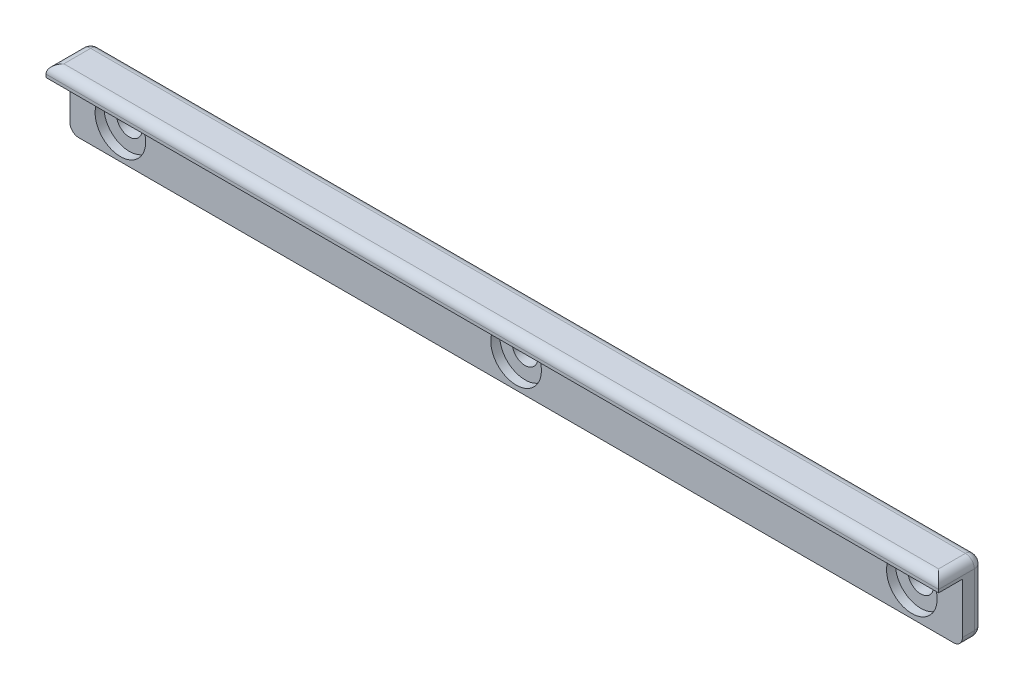
ISO-10303-21;
HEADER;
FILE_DESCRIPTION(('STEP AP214'),'2;1');
FILE_NAME('part.step','',(''),(''),'','','');
FILE_SCHEMA(('AUTOMOTIVE_DESIGN { 1 0 10303 214 1 1 1 1 }'));
ENDSEC;
DATA;
#1=APPLICATION_CONTEXT('core data for automotive mechanical design processes');
#2=APPLICATION_PROTOCOL_DEFINITION('international standard','automotive_design',2000,#1);
#3=PRODUCT_CONTEXT('',#1,'mechanical');
#4=PRODUCT('Part','Part','',(#3));
#5=PRODUCT_RELATED_PRODUCT_CATEGORY('part','',(#4));
#6=PRODUCT_DEFINITION_FORMATION('','',#4);
#7=PRODUCT_DEFINITION_CONTEXT('part definition',#1,'design');
#8=PRODUCT_DEFINITION('design','',#6,#7);
#9=PRODUCT_DEFINITION_SHAPE('','',#8);
#10=(LENGTH_UNIT() NAMED_UNIT(*) SI_UNIT(.MILLI.,.METRE.));
#11=(NAMED_UNIT(*) PLANE_ANGLE_UNIT() SI_UNIT($,.RADIAN.));
#12=(NAMED_UNIT(*) SI_UNIT($,.STERADIAN.) SOLID_ANGLE_UNIT());
#13=UNCERTAINTY_MEASURE_WITH_UNIT(LENGTH_MEASURE(1.E-05),#10,'distance_accuracy_value','');
#14=(GEOMETRIC_REPRESENTATION_CONTEXT(3) GLOBAL_UNCERTAINTY_ASSIGNED_CONTEXT((#13)) GLOBAL_UNIT_ASSIGNED_CONTEXT((#10,
#11,#12)) REPRESENTATION_CONTEXT('',''));
#15=CARTESIAN_POINT('',(0.,0.,0.));
#16=DIRECTION('',(0.,0.,1.));
#17=DIRECTION('',(1.,0.,0.));
#18=AXIS2_PLACEMENT_3D('',#15,#16,#17);
#19=CARTESIAN_POINT('',(0.,0.,1.5));
#20=DIRECTION('',(0.,0.,-1.));
#21=DIRECTION('',(-1.,0.,0.));
#22=AXIS2_PLACEMENT_3D('',#19,#20,#21);
#23=PLANE('',#22);
#24=DIRECTION('',(0.,-1.,0.));
#25=VECTOR('',#24,1.);
#26=CARTESIAN_POINT('',(0.,-10.,1.5));
#27=LINE('',#26,#25);
#28=CARTESIAN_POINT('',(0.,0.,1.5));
#29=VERTEX_POINT('',#28);
#30=CARTESIAN_POINT('',(0.,-8.50000000000002,1.5));
#31=VERTEX_POINT('',#30);
#32=EDGE_CURVE('E215',#29,#31,#27,.T.);
#33=ORIENTED_EDGE('',*,*,#32,.T.);
#34=CARTESIAN_POINT('',(1.5,-8.50000000000002,1.5));
#35=DIRECTION('',(0.,0.,-1.));
#36=DIRECTION('',(-1.,0.,0.));
#37=AXIS2_PLACEMENT_3D('',#34,#35,#36);
#38=CIRCLE('',#37,1.5);
#39=CARTESIAN_POINT('',(1.5,-10.,1.5));
#40=VERTEX_POINT('',#39);
#41=EDGE_CURVE('E266',#31,#40,#38,.F.);
#42=ORIENTED_EDGE('',*,*,#41,.T.);
#43=DIRECTION('',(1.,0.,0.));
#44=VECTOR('',#43,1.);
#45=CARTESIAN_POINT('',(150.,-10.,1.5));
#46=LINE('',#45,#44);
#47=CARTESIAN_POINT('',(148.5,-10.,1.5));
#48=VERTEX_POINT('',#47);
#49=EDGE_CURVE('E222',#40,#48,#46,.T.);
#50=ORIENTED_EDGE('',*,*,#49,.T.);
#51=CARTESIAN_POINT('',(148.5,-8.5,1.5));
#52=DIRECTION('',(0.,0.,-1.));
#53=DIRECTION('',(-1.,0.,0.));
#54=AXIS2_PLACEMENT_3D('',#51,#52,#53);
#55=CIRCLE('',#54,1.5);
#56=CARTESIAN_POINT('',(150.,-8.5,1.5));
#57=VERTEX_POINT('',#56);
#58=EDGE_CURVE('E263',#48,#57,#55,.F.);
#59=ORIENTED_EDGE('',*,*,#58,.T.);
#60=DIRECTION('',(0.,1.,0.));
#61=VECTOR('',#60,1.);
#62=CARTESIAN_POINT('',(150.,0.,1.5));
#63=LINE('',#62,#61);
#64=CARTESIAN_POINT('',(150.,0.,1.5));
#65=VERTEX_POINT('',#64);
#66=EDGE_CURVE('E226',#57,#65,#63,.T.);
#67=ORIENTED_EDGE('',*,*,#66,.T.);
#68=DIRECTION('',(-1.,0.,0.));
#69=VECTOR('',#68,1.);
#70=CARTESIAN_POINT('',(0.,0.,1.5));
#71=LINE('',#70,#69);
#72=EDGE_CURVE('E141',#65,#29,#71,.T.);
#73=ORIENTED_EDGE('',*,*,#72,.T.);
#74=EDGE_LOOP('',(#33,#42,#50,#59,#67,#73));
#75=FACE_BOUND('',#74,.T.);
#76=CARTESIAN_POINT('',(75.,-5.00000000000001,1.5));
#77=DIRECTION('',(0.,0.,1.));
#78=DIRECTION('',(1.,0.,0.));
#79=AXIS2_PLACEMENT_3D('',#76,#77,#78);
#80=CIRCLE('',#79,4.25000000000001);
#81=CARTESIAN_POINT('',(79.25,-5.00000000000001,1.5));
#82=VERTEX_POINT('',#81);
#83=EDGE_CURVE('E211',#82,#82,#80,.T.);
#84=ORIENTED_EDGE('',*,*,#83,.F.);
#85=EDGE_LOOP('',(#84));
#86=FACE_BOUND('',#85,.T.);
#87=CARTESIAN_POINT('',(141.5,-5.,1.5));
#88=DIRECTION('',(0.,0.,1.));
#89=DIRECTION('',(1.,0.,0.));
#90=AXIS2_PLACEMENT_3D('',#87,#88,#89);
#91=CIRCLE('',#90,4.25000000000001);
#92=CARTESIAN_POINT('',(145.75,-5.,1.5));
#93=VERTEX_POINT('',#92);
#94=EDGE_CURVE('E203',#93,#93,#91,.T.);
#95=ORIENTED_EDGE('',*,*,#94,.F.);
#96=EDGE_LOOP('',(#95));
#97=FACE_BOUND('',#96,.T.);
#98=CARTESIAN_POINT('',(8.49999999999999,-5.,1.5));
#99=DIRECTION('',(0.,0.,1.));
#100=DIRECTION('',(1.,0.,0.));
#101=AXIS2_PLACEMENT_3D('',#98,#99,#100);
#102=CIRCLE('',#101,4.25);
#103=CARTESIAN_POINT('',(12.75,-5.,1.5));
#104=VERTEX_POINT('',#103);
#105=EDGE_CURVE('E195',#104,#104,#102,.T.);
#106=ORIENTED_EDGE('',*,*,#105,.F.);
#107=EDGE_LOOP('',(#106));
#108=FACE_BOUND('',#107,.T.);
#109=ADVANCED_FACE('F45',(#75,#86,#97,#108),#23,.F.);
#110=CARTESIAN_POINT('',(0.,-10.,1.5));
#111=DIRECTION('',(1.,0.,0.));
#112=DIRECTION('',(0.,0.,-1.));
#113=AXIS2_PLACEMENT_3D('',#110,#111,#112);
#114=PLANE('',#113);
#115=DIRECTION('',(0.,1.,0.));
#116=VECTOR('',#115,1.);
#117=CARTESIAN_POINT('',(0.,-10.,-0.5));
#118=LINE('',#117,#116);
#119=CARTESIAN_POINT('',(0.,0.5,-0.5));
#120=VERTEX_POINT('',#119);
#121=CARTESIAN_POINT('',(0.,-8.50000000000002,-0.5));
#122=VERTEX_POINT('',#121);
#123=EDGE_CURVE('E247',#120,#122,#118,.F.);
#124=ORIENTED_EDGE('',*,*,#123,.T.);
#125=DIRECTION('',(0.,0.,-1.));
#126=VECTOR('',#125,1.);
#127=CARTESIAN_POINT('',(0.,-8.50000000000002,1.5));
#128=LINE('',#127,#126);
#129=EDGE_CURVE('E251',#122,#31,#128,.F.);
#130=ORIENTED_EDGE('',*,*,#129,.T.);
#131=ORIENTED_EDGE('',*,*,#32,.F.);
#132=DIRECTION('',(0.,0.,1.));
#133=VECTOR('',#132,1.);
#134=CARTESIAN_POINT('',(0.,0.,-2.));
#135=LINE('',#134,#133);
#136=CARTESIAN_POINT('',(0.,0.,5.5));
#137=VERTEX_POINT('',#136);
#138=EDGE_CURVE('E145',#29,#137,#135,.T.);
#139=ORIENTED_EDGE('',*,*,#138,.T.);
#140=DIRECTION('',(0.,-1.,0.));
#141=VECTOR('',#140,1.);
#142=CARTESIAN_POINT('',(0.,0.,5.5));
#143=LINE('',#142,#141);
#144=CARTESIAN_POINT('',(0.,0.5,5.5));
#145=VERTEX_POINT('',#144);
#146=EDGE_CURVE('E146',#145,#137,#143,.T.);
#147=ORIENTED_EDGE('',*,*,#146,.F.);
#148=DIRECTION('',(0.,0.,1.));
#149=VECTOR('',#148,1.);
#150=CARTESIAN_POINT('',(0.,0.5,-2.));
#151=LINE('',#150,#149);
#152=EDGE_CURVE('E244',#145,#120,#151,.F.);
#153=ORIENTED_EDGE('',*,*,#152,.T.);
#154=EDGE_LOOP('',(#124,#130,#131,#139,#147,#153));
#155=FACE_BOUND('',#154,.T.);
#156=ADVANCED_FACE('F391',(#155),#114,.F.);
#157=CARTESIAN_POINT('',(150.,-10.,1.5));
#158=DIRECTION('',(0.,1.,0.));
#159=DIRECTION('',(-1.,0.,0.));
#160=AXIS2_PLACEMENT_3D('',#157,#158,#159);
#161=PLANE('',#160);
#162=ORIENTED_EDGE('',*,*,#49,.F.);
#163=DIRECTION('',(0.,0.,-1.));
#164=VECTOR('',#163,1.);
#165=CARTESIAN_POINT('',(1.5,-10.,1.5));
#166=LINE('',#165,#164);
#167=CARTESIAN_POINT('',(1.5,-10.,-0.5));
#168=VERTEX_POINT('',#167);
#169=EDGE_CURVE('E260',#40,#168,#166,.T.);
#170=ORIENTED_EDGE('',*,*,#169,.T.);
#171=DIRECTION('',(-1.,0.,0.));
#172=VECTOR('',#171,1.);
#173=CARTESIAN_POINT('',(150.,-10.,-0.5));
#174=LINE('',#173,#172);
#175=CARTESIAN_POINT('',(148.5,-10.,-0.5));
#176=VERTEX_POINT('',#175);
#177=EDGE_CURVE('E257',#168,#176,#174,.F.);
#178=ORIENTED_EDGE('',*,*,#177,.T.);
#179=DIRECTION('',(0.,0.,-1.));
#180=VECTOR('',#179,1.);
#181=CARTESIAN_POINT('',(148.5,-10.,1.5));
#182=LINE('',#181,#180);
#183=EDGE_CURVE('E254',#176,#48,#182,.F.);
#184=ORIENTED_EDGE('',*,*,#183,.T.);
#185=EDGE_LOOP('',(#162,#170,#178,#184));
#186=FACE_BOUND('',#185,.T.);
#187=ADVANCED_FACE('F351',(#186),#161,.F.);
#188=CARTESIAN_POINT('',(150.,0.,1.5));
#189=DIRECTION('',(-1.,0.,0.));
#190=DIRECTION('',(0.,0.,1.));
#191=AXIS2_PLACEMENT_3D('',#188,#189,#190);
#192=PLANE('',#191);
#193=ORIENTED_EDGE('',*,*,#66,.F.);
#194=DIRECTION('',(0.,0.,-1.));
#195=VECTOR('',#194,1.);
#196=CARTESIAN_POINT('',(150.,-8.5,1.5));
#197=LINE('',#196,#195);
#198=CARTESIAN_POINT('',(150.,-8.5,-0.5));
#199=VERTEX_POINT('',#198);
#200=EDGE_CURVE('E274',#57,#199,#197,.T.);
#201=ORIENTED_EDGE('',*,*,#200,.T.);
#202=DIRECTION('',(0.,-1.,0.));
#203=VECTOR('',#202,1.);
#204=CARTESIAN_POINT('',(150.,0.,-0.5));
#205=LINE('',#204,#203);
#206=CARTESIAN_POINT('',(150.,0.5,-0.5));
#207=VERTEX_POINT('',#206);
#208=EDGE_CURVE('E271',#199,#207,#205,.F.);
#209=ORIENTED_EDGE('',*,*,#208,.T.);
#210=DIRECTION('',(0.,0.,1.));
#211=VECTOR('',#210,1.);
#212=CARTESIAN_POINT('',(150.,0.5,5.5));
#213=LINE('',#212,#211);
#214=CARTESIAN_POINT('',(150.,0.5,5.5));
#215=VERTEX_POINT('',#214);
#216=EDGE_CURVE('E152',#207,#215,#213,.T.);
#217=ORIENTED_EDGE('',*,*,#216,.T.);
#218=DIRECTION('',(0.,1.,0.));
#219=VECTOR('',#218,1.);
#220=CARTESIAN_POINT('',(150.,2.,5.5));
#221=LINE('',#220,#219);
#222=CARTESIAN_POINT('',(150.,0.,5.5));
#223=VERTEX_POINT('',#222);
#224=EDGE_CURVE('E149',#223,#215,#221,.T.);
#225=ORIENTED_EDGE('',*,*,#224,.F.);
#226=DIRECTION('',(0.,0.,1.));
#227=VECTOR('',#226,1.);
#228=CARTESIAN_POINT('',(150.,0.,-2.));
#229=LINE('',#228,#227);
#230=EDGE_CURVE('E135',#65,#223,#229,.T.);
#231=ORIENTED_EDGE('',*,*,#230,.F.);
#232=EDGE_LOOP('',(#193,#201,#209,#217,#225,#231));
#233=FACE_BOUND('',#232,.T.);
#234=ADVANCED_FACE('F150',(#233),#192,.F.);
#235=CARTESIAN_POINT('',(75.,-5.00000000000001,1.5));
#236=DIRECTION('',(0.,0.,-1.));
#237=DIRECTION('',(-1.,0.,0.));
#238=AXIS2_PLACEMENT_3D('',#235,#236,#237);
#239=CYLINDRICAL_SURFACE('',#238,4.25000000000001);
#240=ORIENTED_EDGE('',*,*,#83,.T.);
#241=EDGE_LOOP('',(#240));
#242=FACE_BOUND('',#241,.T.);
#243=CARTESIAN_POINT('',(75.,-5.00000000000001,0.));
#244=DIRECTION('',(0.,0.,1.));
#245=DIRECTION('',(1.,0.,0.));
#246=AXIS2_PLACEMENT_3D('',#243,#244,#245);
#247=CIRCLE('',#246,4.25000000000001);
#248=CARTESIAN_POINT('',(79.25,-5.00000000000001,0.));
#249=VERTEX_POINT('',#248);
#250=EDGE_CURVE('E207',#249,#249,#247,.T.);
#251=ORIENTED_EDGE('',*,*,#250,.F.);
#252=EDGE_LOOP('',(#251));
#253=FACE_BOUND('',#252,.T.);
#254=ADVANCED_FACE('F416',(#242,#253),#239,.F.);
#255=CARTESIAN_POINT('',(141.5,-5.,1.5));
#256=DIRECTION('',(0.,0.,-1.));
#257=DIRECTION('',(-1.,0.,0.));
#258=AXIS2_PLACEMENT_3D('',#255,#256,#257);
#259=CYLINDRICAL_SURFACE('',#258,4.25000000000001);
#260=ORIENTED_EDGE('',*,*,#94,.T.);
#261=EDGE_LOOP('',(#260));
#262=FACE_BOUND('',#261,.T.);
#263=CARTESIAN_POINT('',(141.5,-5.,0.));
#264=DIRECTION('',(0.,0.,1.));
#265=DIRECTION('',(1.,0.,0.));
#266=AXIS2_PLACEMENT_3D('',#263,#264,#265);
#267=CIRCLE('',#266,4.25000000000001);
#268=CARTESIAN_POINT('',(145.75,-5.,0.));
#269=VERTEX_POINT('',#268);
#270=EDGE_CURVE('E199',#269,#269,#267,.T.);
#271=ORIENTED_EDGE('',*,*,#270,.F.);
#272=EDGE_LOOP('',(#271));
#273=FACE_BOUND('',#272,.T.);
#274=ADVANCED_FACE('F619',(#262,#273),#259,.F.);
#275=CARTESIAN_POINT('',(8.49999999999999,-5.,1.5));
#276=DIRECTION('',(0.,0.,-1.));
#277=DIRECTION('',(-1.,0.,0.));
#278=AXIS2_PLACEMENT_3D('',#275,#276,#277);
#279=CYLINDRICAL_SURFACE('',#278,4.25);
#280=ORIENTED_EDGE('',*,*,#105,.T.);
#281=EDGE_LOOP('',(#280));
#282=FACE_BOUND('',#281,.T.);
#283=CARTESIAN_POINT('',(8.49999999999999,-5.,0.));
#284=DIRECTION('',(0.,0.,1.));
#285=DIRECTION('',(1.,0.,0.));
#286=AXIS2_PLACEMENT_3D('',#283,#284,#285);
#287=CIRCLE('',#286,4.25);
#288=CARTESIAN_POINT('',(12.75,-5.,0.));
#289=VERTEX_POINT('',#288);
#290=EDGE_CURVE('E191',#289,#289,#287,.T.);
#291=ORIENTED_EDGE('',*,*,#290,.F.);
#292=EDGE_LOOP('',(#291));
#293=FACE_BOUND('',#292,.T.);
#294=ADVANCED_FACE('F611',(#282,#293),#279,.F.);
#295=CARTESIAN_POINT('',(0.,0.,0.));
#296=DIRECTION('',(0.,0.,1.));
#297=DIRECTION('',(1.,0.,0.));
#298=AXIS2_PLACEMENT_3D('',#295,#296,#297);
#299=PLANE('',#298);
#300=CARTESIAN_POINT('',(141.5,-5.,0.));
#301=DIRECTION('',(0.,0.,-1.));
#302=DIRECTION('',(-1.,0.,0.));
#303=AXIS2_PLACEMENT_3D('',#300,#301,#302);
#304=CIRCLE('',#303,2.15000000000002);
#305=CARTESIAN_POINT('',(139.35,-5.,0.));
#306=VERTEX_POINT('',#305);
#307=EDGE_CURVE('E169',#306,#306,#304,.T.);
#308=ORIENTED_EDGE('',*,*,#307,.T.);
#309=EDGE_LOOP('',(#308));
#310=FACE_BOUND('',#309,.T.);
#311=ORIENTED_EDGE('',*,*,#270,.T.);
#312=EDGE_LOOP('',(#311));
#313=FACE_BOUND('',#312,.T.);
#314=ADVANCED_FACE('F597',(#310,#313),#299,.T.);
#315=CARTESIAN_POINT('',(75.,-5.00000000000001,0.));
#316=DIRECTION('',(0.,0.,-1.));
#317=DIRECTION('',(-1.,0.,0.));
#318=AXIS2_PLACEMENT_3D('',#315,#316,#317);
#319=CIRCLE('',#318,2.15);
#320=CARTESIAN_POINT('',(72.85,-5.00000000000001,0.));
#321=VERTEX_POINT('',#320);
#322=EDGE_CURVE('E175',#321,#321,#319,.T.);
#323=ORIENTED_EDGE('',*,*,#322,.T.);
#324=EDGE_LOOP('',(#323));
#325=FACE_BOUND('',#324,.T.);
#326=ORIENTED_EDGE('',*,*,#250,.T.);
#327=EDGE_LOOP('',(#326));
#328=FACE_BOUND('',#327,.T.);
#329=ADVANCED_FACE('F594',(#325,#328),#299,.T.);
#330=CARTESIAN_POINT('',(8.49999999999999,-5.,0.));
#331=DIRECTION('',(0.,0.,-1.));
#332=DIRECTION('',(-1.,0.,0.));
#333=AXIS2_PLACEMENT_3D('',#330,#331,#332);
#334=CIRCLE('',#333,2.15);
#335=CARTESIAN_POINT('',(6.34999999999999,-5.,0.));
#336=VERTEX_POINT('',#335);
#337=EDGE_CURVE('E183',#336,#336,#334,.T.);
#338=ORIENTED_EDGE('',*,*,#337,.T.);
#339=EDGE_LOOP('',(#338));
#340=FACE_BOUND('',#339,.T.);
#341=ORIENTED_EDGE('',*,*,#290,.T.);
#342=EDGE_LOOP('',(#341));
#343=FACE_BOUND('',#342,.T.);
#344=ADVANCED_FACE('F439',(#340,#343),#299,.T.);
#345=CARTESIAN_POINT('',(0.,0.,-2.));
#346=DIRECTION('',(0.,0.,1.));
#347=DIRECTION('',(1.,0.,0.));
#348=AXIS2_PLACEMENT_3D('',#345,#346,#347);
#349=PLANE('',#348);
#350=DIRECTION('',(-1.,0.,0.));
#351=VECTOR('',#350,1.);
#352=CARTESIAN_POINT('',(0.,-8.50000000000002,-2.));
#353=LINE('',#352,#351);
#354=CARTESIAN_POINT('',(148.5,-8.5,-2.));
#355=VERTEX_POINT('',#354);
#356=CARTESIAN_POINT('',(1.5,-8.50000000000002,-2.));
#357=VERTEX_POINT('',#356);
#358=EDGE_CURVE('E237',#355,#357,#353,.T.);
#359=ORIENTED_EDGE('',*,*,#358,.T.);
#360=DIRECTION('',(0.,1.,0.));
#361=VECTOR('',#360,1.);
#362=CARTESIAN_POINT('',(1.5,0.,-2.));
#363=LINE('',#362,#361);
#364=CARTESIAN_POINT('',(1.5,0.5,-2.));
#365=VERTEX_POINT('',#364);
#366=EDGE_CURVE('E240',#357,#365,#363,.T.);
#367=ORIENTED_EDGE('',*,*,#366,.T.);
#368=DIRECTION('',(-1.,0.,0.));
#369=VECTOR('',#368,1.);
#370=CARTESIAN_POINT('',(150.,0.5,-2.));
#371=LINE('',#370,#369);
#372=CARTESIAN_POINT('',(148.5,0.5,-2.));
#373=VERTEX_POINT('',#372);
#374=EDGE_CURVE('E231',#365,#373,#371,.F.);
#375=ORIENTED_EDGE('',*,*,#374,.T.);
#376=DIRECTION('',(0.,-1.,0.));
#377=VECTOR('',#376,1.);
#378=CARTESIAN_POINT('',(148.5,0.,-2.));
#379=LINE('',#378,#377);
#380=EDGE_CURVE('E234',#373,#355,#379,.T.);
#381=ORIENTED_EDGE('',*,*,#380,.T.);
#382=EDGE_LOOP('',(#359,#367,#375,#381));
#383=FACE_BOUND('',#382,.T.);
#384=CARTESIAN_POINT('',(8.49999999999999,-5.,-2.));
#385=DIRECTION('',(0.,0.,-1.));
#386=DIRECTION('',(-1.,0.,0.));
#387=AXIS2_PLACEMENT_3D('',#384,#385,#386);
#388=CIRCLE('',#387,2.15);
#389=CARTESIAN_POINT('',(6.34999999999999,-5.,-2.));
#390=VERTEX_POINT('',#389);
#391=EDGE_CURVE('E187',#390,#390,#388,.T.);
#392=ORIENTED_EDGE('',*,*,#391,.F.);
#393=EDGE_LOOP('',(#392));
#394=FACE_BOUND('',#393,.T.);
#395=CARTESIAN_POINT('',(75.,-5.00000000000001,-2.));
#396=DIRECTION('',(0.,0.,-1.));
#397=DIRECTION('',(-1.,0.,0.));
#398=AXIS2_PLACEMENT_3D('',#395,#396,#397);
#399=CIRCLE('',#398,2.15);
#400=CARTESIAN_POINT('',(72.85,-5.00000000000001,-2.));
#401=VERTEX_POINT('',#400);
#402=EDGE_CURVE('E179',#401,#401,#399,.T.);
#403=ORIENTED_EDGE('',*,*,#402,.F.);
#404=EDGE_LOOP('',(#403));
#405=FACE_BOUND('',#404,.T.);
#406=CARTESIAN_POINT('',(141.5,-5.,-2.));
#407=DIRECTION('',(0.,0.,-1.));
#408=DIRECTION('',(-1.,0.,0.));
#409=AXIS2_PLACEMENT_3D('',#406,#407,#408);
#410=CIRCLE('',#409,2.15000000000002);
#411=CARTESIAN_POINT('',(139.35,-5.,-2.));
#412=VERTEX_POINT('',#411);
#413=EDGE_CURVE('E171',#412,#412,#410,.T.);
#414=ORIENTED_EDGE('',*,*,#413,.F.);
#415=EDGE_LOOP('',(#414));
#416=FACE_BOUND('',#415,.T.);
#417=ADVANCED_FACE('F367',(#383,#394,#405,#416),#349,.F.);
#418=CARTESIAN_POINT('',(8.49999999999999,-5.,-2.));
#419=DIRECTION('',(0.,0.,1.));
#420=DIRECTION('',(1.,0.,0.));
#421=AXIS2_PLACEMENT_3D('',#418,#419,#420);
#422=CYLINDRICAL_SURFACE('',#421,2.15);
#423=ORIENTED_EDGE('',*,*,#391,.T.);
#424=EDGE_LOOP('',(#423));
#425=FACE_BOUND('',#424,.T.);
#426=ORIENTED_EDGE('',*,*,#337,.F.);
#427=EDGE_LOOP('',(#426));
#428=FACE_BOUND('',#427,.T.);
#429=ADVANCED_FACE('F438',(#425,#428),#422,.F.);
#430=CARTESIAN_POINT('',(75.,-5.00000000000001,-2.));
#431=DIRECTION('',(0.,0.,1.));
#432=DIRECTION('',(1.,0.,0.));
#433=AXIS2_PLACEMENT_3D('',#430,#431,#432);
#434=CYLINDRICAL_SURFACE('',#433,2.15);
#435=ORIENTED_EDGE('',*,*,#402,.T.);
#436=EDGE_LOOP('',(#435));
#437=FACE_BOUND('',#436,.T.);
#438=ORIENTED_EDGE('',*,*,#322,.F.);
#439=EDGE_LOOP('',(#438));
#440=FACE_BOUND('',#439,.T.);
#441=ADVANCED_FACE('F565',(#437,#440),#434,.F.);
#442=CARTESIAN_POINT('',(141.5,-5.,-2.));
#443=DIRECTION('',(0.,0.,1.));
#444=DIRECTION('',(1.,0.,0.));
#445=AXIS2_PLACEMENT_3D('',#442,#443,#444);
#446=CYLINDRICAL_SURFACE('',#445,2.15000000000002);
#447=ORIENTED_EDGE('',*,*,#413,.T.);
#448=EDGE_LOOP('',(#447));
#449=FACE_BOUND('',#448,.T.);
#450=ORIENTED_EDGE('',*,*,#307,.F.);
#451=EDGE_LOOP('',(#450));
#452=FACE_BOUND('',#451,.T.);
#453=ADVANCED_FACE('F557',(#449,#452),#446,.F.);
#454=CARTESIAN_POINT('',(150.,0.,-2.));
#455=DIRECTION('',(0.,-1.,0.));
#456=DIRECTION('',(0.,0.,-1.));
#457=AXIS2_PLACEMENT_3D('',#454,#455,#456);
#458=PLANE('',#457);
#459=ORIENTED_EDGE('',*,*,#72,.F.);
#460=ORIENTED_EDGE('',*,*,#230,.T.);
#461=DIRECTION('',(1.,0.,0.));
#462=VECTOR('',#461,1.);
#463=CARTESIAN_POINT('',(150.,0.,5.5));
#464=LINE('',#463,#462);
#465=EDGE_CURVE('E139',#137,#223,#464,.T.);
#466=ORIENTED_EDGE('',*,*,#465,.F.);
#467=ORIENTED_EDGE('',*,*,#138,.F.);
#468=EDGE_LOOP('',(#459,#460,#466,#467));
#469=FACE_BOUND('',#468,.T.);
#470=ADVANCED_FACE('F137',(#469),#458,.T.);
#471=CARTESIAN_POINT('',(0.,2.,-2.));
#472=DIRECTION('',(0.,1.,0.));
#473=DIRECTION('',(0.,0.,1.));
#474=AXIS2_PLACEMENT_3D('',#471,#472,#473);
#475=PLANE('',#474);
#476=DIRECTION('',(0.,0.,1.));
#477=VECTOR('',#476,1.);
#478=CARTESIAN_POINT('',(1.5,2.,5.5));
#479=LINE('',#478,#477);
#480=CARTESIAN_POINT('',(1.5,2.,-0.5));
#481=VERTEX_POINT('',#480);
#482=CARTESIAN_POINT('',(1.5,2.,4.));
#483=VERTEX_POINT('',#482);
#484=EDGE_CURVE('E67',#481,#483,#479,.T.);
#485=ORIENTED_EDGE('',*,*,#484,.T.);
#486=DIRECTION('',(-1.,0.,0.));
#487=VECTOR('',#486,1.);
#488=CARTESIAN_POINT('',(150.,2.,4.));
#489=LINE('',#488,#487);
#490=CARTESIAN_POINT('',(148.5,2.,4.));
#491=VERTEX_POINT('',#490);
#492=EDGE_CURVE('E55',#483,#491,#489,.F.);
#493=ORIENTED_EDGE('',*,*,#492,.T.);
#494=DIRECTION('',(0.,0.,1.));
#495=VECTOR('',#494,1.);
#496=CARTESIAN_POINT('',(148.5,2.,-2.));
#497=LINE('',#496,#495);
#498=CARTESIAN_POINT('',(148.5,2.,-0.5));
#499=VERTEX_POINT('',#498);
#500=EDGE_CURVE('E282',#491,#499,#497,.F.);
#501=ORIENTED_EDGE('',*,*,#500,.T.);
#502=DIRECTION('',(-1.,0.,0.));
#503=VECTOR('',#502,1.);
#504=CARTESIAN_POINT('',(0.,2.,-0.5));
#505=LINE('',#504,#503);
#506=EDGE_CURVE('E277',#499,#481,#505,.T.);
#507=ORIENTED_EDGE('',*,*,#506,.T.);
#508=EDGE_LOOP('',(#485,#493,#501,#507));
#509=FACE_BOUND('',#508,.T.);
#510=ADVANCED_FACE('F380',(#509),#475,.T.);
#511=CARTESIAN_POINT('',(0.,0.,5.5));
#512=DIRECTION('',(0.,0.,-1.));
#513=DIRECTION('',(-1.,0.,0.));
#514=AXIS2_PLACEMENT_3D('',#511,#512,#513);
#515=PLANE('',#514);
#516=ORIENTED_EDGE('',*,*,#224,.T.);
#517=DIRECTION('',(-1.,0.,0.));
#518=VECTOR('',#517,1.);
#519=CARTESIAN_POINT('',(0.,0.5,5.5));
#520=LINE('',#519,#518);
#521=EDGE_CURVE('E11',#215,#145,#520,.T.);
#522=ORIENTED_EDGE('',*,*,#521,.T.);
#523=ORIENTED_EDGE('',*,*,#146,.T.);
#524=ORIENTED_EDGE('',*,*,#465,.T.);
#525=EDGE_LOOP('',(#516,#522,#523,#524));
#526=FACE_BOUND('',#525,.T.);
#527=ADVANCED_FACE('F157',(#526),#515,.F.);
#528=CARTESIAN_POINT('',(148.5,-8.5,1.5));
#529=DIRECTION('',(0.,0.,-1.));
#530=DIRECTION('',(-1.,0.,0.));
#531=AXIS2_PLACEMENT_3D('',#528,#529,#530);
#532=CYLINDRICAL_SURFACE('',#531,1.5);
#533=ORIENTED_EDGE('',*,*,#58,.F.);
#534=ORIENTED_EDGE('',*,*,#183,.F.);
#535=CARTESIAN_POINT('',(148.5,-8.5,-0.5));
#536=DIRECTION('',(0.,0.,-1.));
#537=DIRECTION('',(-1.,0.,0.));
#538=AXIS2_PLACEMENT_3D('',#535,#536,#537);
#539=CIRCLE('',#538,1.5);
#540=EDGE_CURVE('E49',#199,#176,#539,.T.);
#541=ORIENTED_EDGE('',*,*,#540,.F.);
#542=ORIENTED_EDGE('',*,*,#200,.F.);
#543=EDGE_LOOP('',(#533,#534,#541,#542));
#544=FACE_BOUND('',#543,.T.);
#545=ADVANCED_FACE('F47',(#544),#532,.T.);
#546=CARTESIAN_POINT('',(148.5,0.,-0.5));
#547=DIRECTION('',(0.,-1.,0.));
#548=DIRECTION('',(0.,0.,-1.));
#549=AXIS2_PLACEMENT_3D('',#546,#547,#548);
#550=CYLINDRICAL_SURFACE('',#549,1.5);
#551=CARTESIAN_POINT('',(148.5,0.5,-0.5));
#552=DIRECTION('',(0.,1.,0.));
#553=DIRECTION('',(0.,0.,1.));
#554=AXIS2_PLACEMENT_3D('',#551,#552,#553);
#555=CIRCLE('',#554,1.5);
#556=EDGE_CURVE('E329',#207,#373,#555,.T.);
#557=ORIENTED_EDGE('',*,*,#556,.F.);
#558=ORIENTED_EDGE('',*,*,#208,.F.);
#559=CARTESIAN_POINT('',(148.5,-8.5,-0.5));
#560=DIRECTION('',(0.,-1.,0.));
#561=DIRECTION('',(0.,0.,-1.));
#562=AXIS2_PLACEMENT_3D('',#559,#560,#561);
#563=CIRCLE('',#562,1.5);
#564=EDGE_CURVE('E164',#355,#199,#563,.T.);
#565=ORIENTED_EDGE('',*,*,#564,.F.);
#566=ORIENTED_EDGE('',*,*,#380,.F.);
#567=EDGE_LOOP('',(#557,#558,#565,#566));
#568=FACE_BOUND('',#567,.T.);
#569=ADVANCED_FACE('F344',(#568),#550,.T.);
#570=CARTESIAN_POINT('',(148.5,0.5,1.5));
#571=DIRECTION('',(0.,0.,-1.));
#572=DIRECTION('',(-1.,0.,0.));
#573=AXIS2_PLACEMENT_3D('',#570,#571,#572);
#574=CYLINDRICAL_SURFACE('',#573,1.5);
#575=CARTESIAN_POINT('',(148.5,0.5,4.));
#576=DIRECTION('',(0.707106781186547,0.,-0.707106781186547));
#577=DIRECTION('',(0.707106781186547,0.,0.707106781186547));
#578=AXIS2_PLACEMENT_3D('',#575,#576,#577);
#579=ELLIPSE('',#578,2.12132034355964,1.5);
#580=EDGE_CURVE('E321',#215,#491,#579,.F.);
#581=ORIENTED_EDGE('',*,*,#580,.F.);
#582=ORIENTED_EDGE('',*,*,#216,.F.);
#583=CARTESIAN_POINT('',(148.5,0.5,-0.5));
#584=DIRECTION('',(0.,0.,-1.));
#585=DIRECTION('',(-1.,0.,0.));
#586=AXIS2_PLACEMENT_3D('',#583,#584,#585);
#587=CIRCLE('',#586,1.5);
#588=EDGE_CURVE('E325',#499,#207,#587,.T.);
#589=ORIENTED_EDGE('',*,*,#588,.F.);
#590=ORIENTED_EDGE('',*,*,#500,.F.);
#591=EDGE_LOOP('',(#581,#582,#589,#590));
#592=FACE_BOUND('',#591,.T.);
#593=ADVANCED_FACE('F379',(#592),#574,.T.);
#594=CARTESIAN_POINT('',(148.5,-8.5,-0.5));
#595=DIRECTION('',(1.,0.,0.));
#596=DIRECTION('',(0.,0.,-1.));
#597=AXIS2_PLACEMENT_3D('',#594,#595,#596);
#598=SPHERICAL_SURFACE('',#597,1.5);
#599=ORIENTED_EDGE('',*,*,#564,.T.);
#600=ORIENTED_EDGE('',*,*,#540,.T.);
#601=CARTESIAN_POINT('',(148.5,-8.5,-0.5));
#602=DIRECTION('',(1.,0.,0.));
#603=DIRECTION('',(0.,0.,-1.));
#604=AXIS2_PLACEMENT_3D('',#601,#602,#603);
#605=CIRCLE('',#604,1.5);
#606=EDGE_CURVE('E317',#355,#176,#605,.F.);
#607=ORIENTED_EDGE('',*,*,#606,.F.);
#608=EDGE_LOOP('',(#599,#600,#607));
#609=FACE_BOUND('',#608,.T.);
#610=ADVANCED_FACE('F337',(#609),#598,.T.);
#611=CARTESIAN_POINT('',(148.5,0.5,-0.5));
#612=DIRECTION('',(1.,0.,0.));
#613=DIRECTION('',(0.,0.,-1.));
#614=AXIS2_PLACEMENT_3D('',#611,#612,#613);
#615=SPHERICAL_SURFACE('',#614,1.5);
#616=ORIENTED_EDGE('',*,*,#588,.T.);
#617=ORIENTED_EDGE('',*,*,#556,.T.);
#618=CARTESIAN_POINT('',(148.5,0.5,-0.5));
#619=DIRECTION('',(1.,0.,0.));
#620=DIRECTION('',(0.,0.,-1.));
#621=AXIS2_PLACEMENT_3D('',#618,#619,#620);
#622=CIRCLE('',#621,1.5);
#623=EDGE_CURVE('E313',#499,#373,#622,.F.);
#624=ORIENTED_EDGE('',*,*,#623,.F.);
#625=EDGE_LOOP('',(#616,#617,#624));
#626=FACE_BOUND('',#625,.T.);
#627=ADVANCED_FACE('F377',(#626),#615,.T.);
#628=CARTESIAN_POINT('',(0.,0.5,4.));
#629=DIRECTION('',(1.,0.,0.));
#630=DIRECTION('',(0.,0.,-1.));
#631=AXIS2_PLACEMENT_3D('',#628,#629,#630);
#632=CYLINDRICAL_SURFACE('',#631,1.5);
#633=ORIENTED_EDGE('',*,*,#580,.T.);
#634=ORIENTED_EDGE('',*,*,#492,.F.);
#635=CARTESIAN_POINT('',(1.5,0.5,4.));
#636=DIRECTION('',(0.707106781186547,0.,0.707106781186547));
#637=DIRECTION('',(0.707106781186547,0.,-0.707106781186547));
#638=AXIS2_PLACEMENT_3D('',#635,#636,#637);
#639=ELLIPSE('',#638,2.12132034355964,1.5);
#640=EDGE_CURVE('E309',#145,#483,#639,.F.);
#641=ORIENTED_EDGE('',*,*,#640,.F.);
#642=ORIENTED_EDGE('',*,*,#521,.F.);
#643=EDGE_LOOP('',(#633,#634,#641,#642));
#644=FACE_BOUND('',#643,.T.);
#645=ADVANCED_FACE('F389',(#644),#632,.T.);
#646=CARTESIAN_POINT('',(1.5,-8.50000000000002,1.5));
#647=DIRECTION('',(0.,0.,-1.));
#648=DIRECTION('',(-1.,0.,0.));
#649=AXIS2_PLACEMENT_3D('',#646,#647,#648);
#650=CYLINDRICAL_SURFACE('',#649,1.5);
#651=ORIENTED_EDGE('',*,*,#41,.F.);
#652=ORIENTED_EDGE('',*,*,#129,.F.);
#653=CARTESIAN_POINT('',(1.5,-8.50000000000002,-0.5));
#654=DIRECTION('',(0.,0.,-1.));
#655=DIRECTION('',(-1.,0.,0.));
#656=AXIS2_PLACEMENT_3D('',#653,#654,#655);
#657=CIRCLE('',#656,1.5);
#658=EDGE_CURVE('E305',#168,#122,#657,.T.);
#659=ORIENTED_EDGE('',*,*,#658,.F.);
#660=ORIENTED_EDGE('',*,*,#169,.F.);
#661=EDGE_LOOP('',(#651,#652,#659,#660));
#662=FACE_BOUND('',#661,.T.);
#663=ADVANCED_FACE('F360',(#662),#650,.T.);
#664=CARTESIAN_POINT('',(0.,-8.50000000000002,-0.5));
#665=DIRECTION('',(-1.,0.,0.));
#666=DIRECTION('',(0.,-1.,0.));
#667=AXIS2_PLACEMENT_3D('',#664,#665,#666);
#668=CYLINDRICAL_SURFACE('',#667,1.5);
#669=ORIENTED_EDGE('',*,*,#606,.T.);
#670=ORIENTED_EDGE('',*,*,#177,.F.);
#671=CARTESIAN_POINT('',(1.5,-8.50000000000002,-0.5));
#672=DIRECTION('',(-1.,0.,0.));
#673=DIRECTION('',(0.,-1.,0.));
#674=AXIS2_PLACEMENT_3D('',#671,#672,#673);
#675=CIRCLE('',#674,1.5);
#676=EDGE_CURVE('E301',#357,#168,#675,.T.);
#677=ORIENTED_EDGE('',*,*,#676,.F.);
#678=ORIENTED_EDGE('',*,*,#358,.F.);
#679=EDGE_LOOP('',(#669,#670,#677,#678));
#680=FACE_BOUND('',#679,.T.);
#681=ADVANCED_FACE('F364',(#680),#668,.T.);
#682=CARTESIAN_POINT('',(0.,0.5,-0.5));
#683=DIRECTION('',(1.,0.,0.));
#684=DIRECTION('',(0.,0.,-1.));
#685=AXIS2_PLACEMENT_3D('',#682,#683,#684);
#686=CYLINDRICAL_SURFACE('',#685,1.5);
#687=ORIENTED_EDGE('',*,*,#623,.T.);
#688=ORIENTED_EDGE('',*,*,#374,.F.);
#689=CARTESIAN_POINT('',(1.5,0.5,-0.5));
#690=DIRECTION('',(-1.,0.,0.));
#691=DIRECTION('',(0.,0.,1.));
#692=AXIS2_PLACEMENT_3D('',#689,#690,#691);
#693=CIRCLE('',#692,1.5);
#694=EDGE_CURVE('E297',#481,#365,#693,.T.);
#695=ORIENTED_EDGE('',*,*,#694,.F.);
#696=ORIENTED_EDGE('',*,*,#506,.F.);
#697=EDGE_LOOP('',(#687,#688,#695,#696));
#698=FACE_BOUND('',#697,.T.);
#699=ADVANCED_FACE('F373',(#698),#686,.T.);
#700=CARTESIAN_POINT('',(1.5,0.5,-2.));
#701=DIRECTION('',(0.,0.,-1.));
#702=DIRECTION('',(-1.,0.,0.));
#703=AXIS2_PLACEMENT_3D('',#700,#701,#702);
#704=CYLINDRICAL_SURFACE('',#703,1.5);
#705=ORIENTED_EDGE('',*,*,#640,.T.);
#706=ORIENTED_EDGE('',*,*,#484,.F.);
#707=CARTESIAN_POINT('',(1.5,0.5,-0.5));
#708=DIRECTION('',(0.,0.,-1.));
#709=DIRECTION('',(-1.,0.,0.));
#710=AXIS2_PLACEMENT_3D('',#707,#708,#709);
#711=CIRCLE('',#710,1.5);
#712=EDGE_CURVE('E293',#120,#481,#711,.T.);
#713=ORIENTED_EDGE('',*,*,#712,.F.);
#714=ORIENTED_EDGE('',*,*,#152,.F.);
#715=EDGE_LOOP('',(#705,#706,#713,#714));
#716=FACE_BOUND('',#715,.T.);
#717=ADVANCED_FACE('F383',(#716),#704,.T.);
#718=CARTESIAN_POINT('',(1.5,-8.50000000000002,-0.5));
#719=DIRECTION('',(0.,-1.,0.));
#720=DIRECTION('',(1.,0.,0.));
#721=AXIS2_PLACEMENT_3D('',#718,#719,#720);
#722=SPHERICAL_SURFACE('',#721,1.5);
#723=ORIENTED_EDGE('',*,*,#676,.T.);
#724=ORIENTED_EDGE('',*,*,#658,.T.);
#725=CARTESIAN_POINT('',(1.5,-8.50000000000002,-0.5));
#726=DIRECTION('',(0.,-1.,0.));
#727=DIRECTION('',(0.,0.,-1.));
#728=AXIS2_PLACEMENT_3D('',#725,#726,#727);
#729=CIRCLE('',#728,1.5);
#730=EDGE_CURVE('E290',#357,#122,#729,.F.);
#731=ORIENTED_EDGE('',*,*,#730,.F.);
#732=EDGE_LOOP('',(#723,#724,#731));
#733=FACE_BOUND('',#732,.T.);
#734=ADVANCED_FACE('F398',(#733),#722,.T.);
#735=CARTESIAN_POINT('',(1.5,0.5,-0.5));
#736=DIRECTION('',(0.,1.,0.));
#737=DIRECTION('',(0.,0.,1.));
#738=AXIS2_PLACEMENT_3D('',#735,#736,#737);
#739=SPHERICAL_SURFACE('',#738,1.5);
#740=ORIENTED_EDGE('',*,*,#712,.T.);
#741=ORIENTED_EDGE('',*,*,#694,.T.);
#742=CARTESIAN_POINT('',(1.5,0.5,-0.5));
#743=DIRECTION('',(0.,1.,0.));
#744=DIRECTION('',(0.,0.,1.));
#745=AXIS2_PLACEMENT_3D('',#742,#743,#744);
#746=CIRCLE('',#745,1.5);
#747=EDGE_CURVE('E287',#120,#365,#746,.F.);
#748=ORIENTED_EDGE('',*,*,#747,.F.);
#749=EDGE_LOOP('',(#740,#741,#748));
#750=FACE_BOUND('',#749,.T.);
#751=ADVANCED_FACE('F396',(#750),#739,.T.);
#752=CARTESIAN_POINT('',(1.5,0.,-0.5));
#753=DIRECTION('',(0.,1.,0.));
#754=DIRECTION('',(0.,0.,1.));
#755=AXIS2_PLACEMENT_3D('',#752,#753,#754);
#756=CYLINDRICAL_SURFACE('',#755,1.5);
#757=ORIENTED_EDGE('',*,*,#730,.T.);
#758=ORIENTED_EDGE('',*,*,#123,.F.);
#759=ORIENTED_EDGE('',*,*,#747,.T.);
#760=ORIENTED_EDGE('',*,*,#366,.F.);
#761=EDGE_LOOP('',(#757,#758,#759,#760));
#762=FACE_BOUND('',#761,.T.);
#763=ADVANCED_FACE('F394',(#762),#756,.T.);
#764=CLOSED_SHELL('',(#109,#156,#187,#234,#254,#274,#294,#314,#329,#344,#417,#429,#441,#453,
#470,#510,#527,#545,#569,#593,#610,#627,#645,#663,#681,#699,#717,#734,#751,#763));
#765=MANIFOLD_SOLID_BREP('B2',#764);
#766=ADVANCED_BREP_SHAPE_REPRESENTATION('',(#18,#765),#14);
#767=SHAPE_DEFINITION_REPRESENTATION(#9,#766);
ENDSEC;
END-ISO-10303-21;
